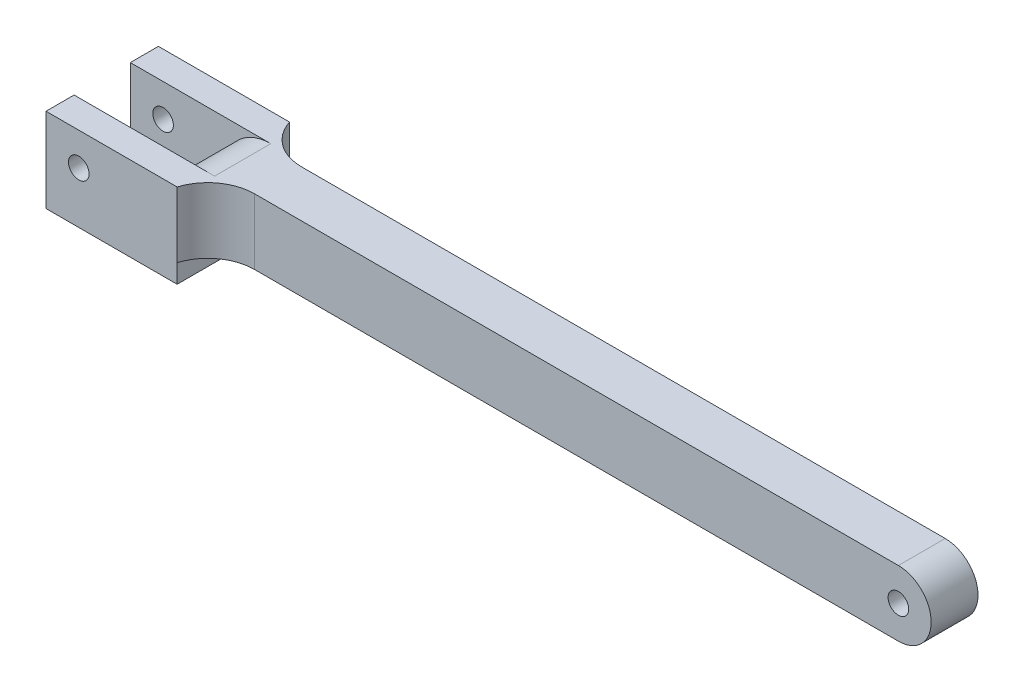
ISO-10303-21;
HEADER;
FILE_DESCRIPTION(('STEP AP214'),'2;1');
FILE_NAME('part.step','',(''),(''),'','','');
FILE_SCHEMA(('AUTOMOTIVE_DESIGN { 1 0 10303 214 1 1 1 1 }'));
ENDSEC;
DATA;
#1=APPLICATION_CONTEXT('core data for automotive mechanical design processes');
#2=APPLICATION_PROTOCOL_DEFINITION('international standard','automotive_design',2000,#1);
#3=PRODUCT_CONTEXT('',#1,'mechanical');
#4=PRODUCT('Part','Part','',(#3));
#5=PRODUCT_RELATED_PRODUCT_CATEGORY('part','',(#4));
#6=PRODUCT_DEFINITION_FORMATION('','',#4);
#7=PRODUCT_DEFINITION_CONTEXT('part definition',#1,'design');
#8=PRODUCT_DEFINITION('design','',#6,#7);
#9=PRODUCT_DEFINITION_SHAPE('','',#8);
#10=(LENGTH_UNIT() NAMED_UNIT(*) SI_UNIT(.MILLI.,.METRE.));
#11=(NAMED_UNIT(*) PLANE_ANGLE_UNIT() SI_UNIT($,.RADIAN.));
#12=(NAMED_UNIT(*) SI_UNIT($,.STERADIAN.) SOLID_ANGLE_UNIT());
#13=UNCERTAINTY_MEASURE_WITH_UNIT(LENGTH_MEASURE(1.E-05),#10,'distance_accuracy_value','');
#14=(GEOMETRIC_REPRESENTATION_CONTEXT(3) GLOBAL_UNCERTAINTY_ASSIGNED_CONTEXT((#13)) GLOBAL_UNIT_ASSIGNED_CONTEXT((#10,
#11,#12)) REPRESENTATION_CONTEXT('',''));
#15=CARTESIAN_POINT('',(0.,0.,0.));
#16=DIRECTION('',(0.,0.,1.));
#17=DIRECTION('',(1.,0.,0.));
#18=AXIS2_PLACEMENT_3D('',#15,#16,#17);
#19=CARTESIAN_POINT('',(-4.,-5.5,-3.5));
#20=DIRECTION('',(-1.,0.,0.));
#21=DIRECTION('',(0.,-1.,0.));
#22=AXIS2_PLACEMENT_3D('',#19,#20,#21);
#23=PLANE('',#22);
#24=DIRECTION('',(0.,-1.,0.));
#25=VECTOR('',#24,1.);
#26=CARTESIAN_POINT('',(-4.,3.5,5.5));
#27=LINE('',#26,#25);
#28=CARTESIAN_POINT('',(-4.,3.5,5.5));
#29=VERTEX_POINT('',#28);
#30=CARTESIAN_POINT('',(-4.,-5.5,5.5));
#31=VERTEX_POINT('',#30);
#32=EDGE_CURVE('E163',#29,#31,#27,.T.);
#33=ORIENTED_EDGE('',*,*,#32,.T.);
#34=DIRECTION('',(0.,0.,1.));
#35=VECTOR('',#34,1.);
#36=CARTESIAN_POINT('',(-4.,-5.5,-3.5));
#37=LINE('',#36,#35);
#38=CARTESIAN_POINT('',(-4.,-5.5,8.5));
#39=VERTEX_POINT('',#38);
#40=EDGE_CURVE('E169',#31,#39,#37,.T.);
#41=ORIENTED_EDGE('',*,*,#40,.T.);
#42=DIRECTION('',(0.,1.,0.));
#43=VECTOR('',#42,1.);
#44=CARTESIAN_POINT('',(-4.,-5.5,8.5));
#45=LINE('',#44,#43);
#46=CARTESIAN_POINT('',(-4.,3.5,8.5));
#47=VERTEX_POINT('',#46);
#48=EDGE_CURVE('E181',#39,#47,#45,.T.);
#49=ORIENTED_EDGE('',*,*,#48,.T.);
#50=DIRECTION('',(0.,0.,1.));
#51=VECTOR('',#50,1.);
#52=CARTESIAN_POINT('',(-4.,3.5,-3.5));
#53=LINE('',#52,#51);
#54=EDGE_CURVE('E159',#29,#47,#53,.T.);
#55=ORIENTED_EDGE('',*,*,#54,.F.);
#56=EDGE_LOOP('',(#33,#41,#49,#55));
#57=FACE_BOUND('',#56,.T.);
#58=ADVANCED_FACE('F33',(#57),#23,.T.);
#59=CARTESIAN_POINT('',(0.,-3.5,5.));
#60=DIRECTION('',(0.,1.,0.));
#61=DIRECTION('',(-1.,0.,0.));
#62=AXIS2_PLACEMENT_3D('',#59,#60,#61);
#63=PLANE('',#62);
#64=DIRECTION('',(1.,0.,0.));
#65=VECTOR('',#64,1.);
#66=CARTESIAN_POINT('',(0.,-3.5,5.));
#67=LINE('',#66,#65);
#68=CARTESIAN_POINT('',(14.7696960070847,-3.5,5.));
#69=VERTEX_POINT('',#68);
#70=CARTESIAN_POINT('',(83.5000000000008,-3.50000000000001,5.));
#71=VERTEX_POINT('',#70);
#72=EDGE_CURVE('E186',#69,#71,#67,.T.);
#73=ORIENTED_EDGE('',*,*,#72,.F.);
#74=CARTESIAN_POINT('',(14.7696960070847,-3.5,10.));
#75=DIRECTION('',(0.,1.,0.));
#76=DIRECTION('',(-1.,0.,0.));
#77=AXIS2_PLACEMENT_3D('',#74,#75,#76);
#78=CIRCLE('',#77,5.);
#79=CARTESIAN_POINT('',(10.,-3.5,8.5));
#80=VERTEX_POINT('',#79);
#81=EDGE_CURVE('E222',#69,#80,#78,.T.);
#82=ORIENTED_EDGE('',*,*,#81,.T.);
#83=DIRECTION('',(0.,0.,-1.));
#84=VECTOR('',#83,1.);
#85=CARTESIAN_POINT('',(10.,-3.5,5.));
#86=LINE('',#85,#84);
#87=CARTESIAN_POINT('',(10.,-3.5,-3.5));
#88=VERTEX_POINT('',#87);
#89=EDGE_CURVE('E172',#80,#88,#86,.T.);
#90=ORIENTED_EDGE('',*,*,#89,.T.);
#91=CARTESIAN_POINT('',(14.7696960070847,-3.5,-5.));
#92=DIRECTION('',(0.,1.,0.));
#93=DIRECTION('',(-1.,0.,0.));
#94=AXIS2_PLACEMENT_3D('',#91,#92,#93);
#95=CIRCLE('',#94,5.);
#96=CARTESIAN_POINT('',(14.7696960070847,-3.5,0.));
#97=VERTEX_POINT('',#96);
#98=EDGE_CURVE('E227',#88,#97,#95,.T.);
#99=ORIENTED_EDGE('',*,*,#98,.T.);
#100=DIRECTION('',(1.,0.,0.));
#101=VECTOR('',#100,1.);
#102=CARTESIAN_POINT('',(0.,-3.5,0.));
#103=LINE('',#102,#101);
#104=CARTESIAN_POINT('',(83.5000000000008,-3.50000000000001,0.));
#105=VERTEX_POINT('',#104);
#106=EDGE_CURVE('E185',#97,#105,#103,.T.);
#107=ORIENTED_EDGE('',*,*,#106,.T.);
#108=DIRECTION('',(0.,0.,-1.));
#109=VECTOR('',#108,1.);
#110=CARTESIAN_POINT('',(83.5000000000008,-3.50000000000001,5.));
#111=LINE('',#110,#109);
#112=EDGE_CURVE('E208',#71,#105,#111,.T.);
#113=ORIENTED_EDGE('',*,*,#112,.F.);
#114=EDGE_LOOP('',(#73,#82,#90,#99,#107,#113));
#115=FACE_BOUND('',#114,.T.);
#116=ADVANCED_FACE('F242',(#115),#63,.F.);
#117=CARTESIAN_POINT('',(83.5000000000008,0.,5.));
#118=DIRECTION('',(0.,0.,-1.));
#119=DIRECTION('',(-1.,0.,0.));
#120=AXIS2_PLACEMENT_3D('',#117,#118,#119);
#121=CYLINDRICAL_SURFACE('',#120,3.50000000000001);
#122=CARTESIAN_POINT('',(83.5000000000008,0.,0.));
#123=DIRECTION('',(0.,0.,1.));
#124=DIRECTION('',(1.,0.,0.));
#125=AXIS2_PLACEMENT_3D('',#122,#123,#124);
#126=CIRCLE('',#125,3.50000000000001);
#127=CARTESIAN_POINT('',(83.5000000000008,3.50000000000001,0.));
#128=VERTEX_POINT('',#127);
#129=EDGE_CURVE('E199',#105,#128,#126,.T.);
#130=ORIENTED_EDGE('',*,*,#129,.T.);
#131=DIRECTION('',(0.,0.,-1.));
#132=VECTOR('',#131,1.);
#133=CARTESIAN_POINT('',(83.5000000000008,3.50000000000001,5.));
#134=LINE('',#133,#132);
#135=CARTESIAN_POINT('',(83.5000000000008,3.50000000000001,5.));
#136=VERTEX_POINT('',#135);
#137=EDGE_CURVE('E197',#136,#128,#134,.T.);
#138=ORIENTED_EDGE('',*,*,#137,.F.);
#139=CARTESIAN_POINT('',(83.5000000000008,0.,5.));
#140=DIRECTION('',(0.,0.,1.));
#141=DIRECTION('',(1.,0.,0.));
#142=AXIS2_PLACEMENT_3D('',#139,#140,#141);
#143=CIRCLE('',#142,3.50000000000001);
#144=EDGE_CURVE('E188',#71,#136,#143,.T.);
#145=ORIENTED_EDGE('',*,*,#144,.F.);
#146=ORIENTED_EDGE('',*,*,#112,.T.);
#147=EDGE_LOOP('',(#130,#138,#145,#146));
#148=FACE_BOUND('',#147,.T.);
#149=ADVANCED_FACE('F248',(#148),#121,.T.);
#150=CARTESIAN_POINT('',(0.,3.5,5.));
#151=DIRECTION('',(0.,1.,0.));
#152=DIRECTION('',(-1.,0.,0.));
#153=AXIS2_PLACEMENT_3D('',#150,#151,#152);
#154=PLANE('',#153);
#155=DIRECTION('',(0.,0.,1.));
#156=VECTOR('',#155,1.);
#157=CARTESIAN_POINT('',(11.,3.5,5.5));
#158=LINE('',#157,#156);
#159=CARTESIAN_POINT('',(11.,3.5,-0.499999999999999));
#160=VERTEX_POINT('',#159);
#161=CARTESIAN_POINT('',(11.,3.5,5.5));
#162=VERTEX_POINT('',#161);
#163=EDGE_CURVE('E229',#160,#162,#158,.T.);
#164=ORIENTED_EDGE('',*,*,#163,.T.);
#165=DIRECTION('',(-1.,0.,0.));
#166=VECTOR('',#165,1.);
#167=CARTESIAN_POINT('',(-4.,3.5,5.5));
#168=LINE('',#167,#166);
#169=EDGE_CURVE('E142',#162,#29,#168,.T.);
#170=ORIENTED_EDGE('',*,*,#169,.T.);
#171=ORIENTED_EDGE('',*,*,#54,.T.);
#172=DIRECTION('',(1.,0.,0.));
#173=VECTOR('',#172,1.);
#174=CARTESIAN_POINT('',(-4.,3.5,8.5));
#175=LINE('',#174,#173);
#176=CARTESIAN_POINT('',(10.,3.5,8.5));
#177=VERTEX_POINT('',#176);
#178=EDGE_CURVE('E158',#47,#177,#175,.T.);
#179=ORIENTED_EDGE('',*,*,#178,.T.);
#180=CARTESIAN_POINT('',(14.7696960070847,3.5,10.));
#181=DIRECTION('',(0.,1.,0.));
#182=DIRECTION('',(-1.,0.,0.));
#183=AXIS2_PLACEMENT_3D('',#180,#181,#182);
#184=CIRCLE('',#183,5.);
#185=CARTESIAN_POINT('',(14.7696960070847,3.5,5.));
#186=VERTEX_POINT('',#185);
#187=EDGE_CURVE('E220',#177,#186,#184,.F.);
#188=ORIENTED_EDGE('',*,*,#187,.T.);
#189=DIRECTION('',(1.,0.,0.));
#190=VECTOR('',#189,1.);
#191=CARTESIAN_POINT('',(0.,3.5,5.));
#192=LINE('',#191,#190);
#193=EDGE_CURVE('E192',#186,#136,#192,.T.);
#194=ORIENTED_EDGE('',*,*,#193,.T.);
#195=ORIENTED_EDGE('',*,*,#137,.T.);
#196=DIRECTION('',(1.,0.,0.));
#197=VECTOR('',#196,1.);
#198=CARTESIAN_POINT('',(0.,3.5,0.));
#199=LINE('',#198,#197);
#200=CARTESIAN_POINT('',(14.7696960070847,3.5,0.));
#201=VERTEX_POINT('',#200);
#202=EDGE_CURVE('E202',#201,#128,#199,.T.);
#203=ORIENTED_EDGE('',*,*,#202,.F.);
#204=CARTESIAN_POINT('',(14.7696960070847,3.5,-5.));
#205=DIRECTION('',(0.,1.,0.));
#206=DIRECTION('',(-1.,0.,0.));
#207=AXIS2_PLACEMENT_3D('',#204,#205,#206);
#208=CIRCLE('',#207,5.);
#209=CARTESIAN_POINT('',(10.,3.5,-3.5));
#210=VERTEX_POINT('',#209);
#211=EDGE_CURVE('E225',#201,#210,#208,.F.);
#212=ORIENTED_EDGE('',*,*,#211,.T.);
#213=DIRECTION('',(-1.,0.,0.));
#214=VECTOR('',#213,1.);
#215=CARTESIAN_POINT('',(-4.,3.5,-3.5));
#216=LINE('',#215,#214);
#217=CARTESIAN_POINT('',(-4.,3.5,-3.5));
#218=VERTEX_POINT('',#217);
#219=EDGE_CURVE('E157',#210,#218,#216,.T.);
#220=ORIENTED_EDGE('',*,*,#219,.T.);
#221=CARTESIAN_POINT('',(-4.,3.5,-0.499999999999999));
#222=VERTEX_POINT('',#221);
#223=EDGE_CURVE('E149',#218,#222,#53,.T.);
#224=ORIENTED_EDGE('',*,*,#223,.T.);
#225=DIRECTION('',(1.,0.,0.));
#226=VECTOR('',#225,1.);
#227=CARTESIAN_POINT('',(-4.,3.5,-0.499999999999999));
#228=LINE('',#227,#226);
#229=EDGE_CURVE('E131',#222,#160,#228,.T.);
#230=ORIENTED_EDGE('',*,*,#229,.T.);
#231=EDGE_LOOP('',(#164,#170,#171,#179,#188,#194,#195,#203,#212,#220,#224,#230));
#232=FACE_BOUND('',#231,.T.);
#233=ADVANCED_FACE('F155',(#232),#154,.T.);
#234=CARTESIAN_POINT('',(83.5000000000008,0.,5.));
#235=DIRECTION('',(0.,0.,-1.));
#236=DIRECTION('',(-1.,0.,0.));
#237=AXIS2_PLACEMENT_3D('',#234,#235,#236);
#238=CYLINDRICAL_SURFACE('',#237,1.10000000000001);
#239=CARTESIAN_POINT('',(83.5000000000008,0.,5.));
#240=DIRECTION('',(0.,0.,1.));
#241=DIRECTION('',(1.,0.,0.));
#242=AXIS2_PLACEMENT_3D('',#239,#240,#241);
#243=CIRCLE('',#242,1.10000000000001);
#244=CARTESIAN_POINT('',(84.6000000000008,0.,5.));
#245=VERTEX_POINT('',#244);
#246=EDGE_CURVE('E194',#245,#245,#243,.T.);
#247=ORIENTED_EDGE('',*,*,#246,.T.);
#248=EDGE_LOOP('',(#247));
#249=FACE_BOUND('',#248,.T.);
#250=CARTESIAN_POINT('',(83.5000000000008,0.,0.));
#251=DIRECTION('',(0.,0.,1.));
#252=DIRECTION('',(1.,0.,0.));
#253=AXIS2_PLACEMENT_3D('',#250,#251,#252);
#254=CIRCLE('',#253,1.10000000000001);
#255=CARTESIAN_POINT('',(84.6000000000008,0.,0.));
#256=VERTEX_POINT('',#255);
#257=EDGE_CURVE('E189',#256,#256,#254,.T.);
#258=ORIENTED_EDGE('',*,*,#257,.F.);
#259=EDGE_LOOP('',(#258));
#260=FACE_BOUND('',#259,.T.);
#261=ADVANCED_FACE('F270',(#249,#260),#238,.F.);
#262=CARTESIAN_POINT('',(0.,0.,5.));
#263=DIRECTION('',(0.,0.,1.));
#264=DIRECTION('',(1.,0.,0.));
#265=AXIS2_PLACEMENT_3D('',#262,#263,#264);
#266=PLANE('',#265);
#267=ORIENTED_EDGE('',*,*,#193,.F.);
#268=DIRECTION('',(0.,1.,0.));
#269=VECTOR('',#268,1.);
#270=CARTESIAN_POINT('',(14.7696960070847,-3.5,5.));
#271=LINE('',#270,#269);
#272=EDGE_CURVE('E211',#186,#69,#271,.F.);
#273=ORIENTED_EDGE('',*,*,#272,.T.);
#274=ORIENTED_EDGE('',*,*,#72,.T.);
#275=ORIENTED_EDGE('',*,*,#144,.T.);
#276=EDGE_LOOP('',(#267,#273,#274,#275));
#277=FACE_BOUND('',#276,.T.);
#278=ORIENTED_EDGE('',*,*,#246,.F.);
#279=EDGE_LOOP('',(#278));
#280=FACE_BOUND('',#279,.T.);
#281=ADVANCED_FACE('F264',(#277,#280),#266,.T.);
#282=CARTESIAN_POINT('',(0.,0.,0.));
#283=DIRECTION('',(0.,0.,1.));
#284=DIRECTION('',(1.,0.,0.));
#285=AXIS2_PLACEMENT_3D('',#282,#283,#284);
#286=PLANE('',#285);
#287=ORIENTED_EDGE('',*,*,#106,.F.);
#288=DIRECTION('',(0.,1.,0.));
#289=VECTOR('',#288,1.);
#290=CARTESIAN_POINT('',(14.7696960070847,0.,0.));
#291=LINE('',#290,#289);
#292=EDGE_CURVE('E217',#97,#201,#291,.T.);
#293=ORIENTED_EDGE('',*,*,#292,.T.);
#294=ORIENTED_EDGE('',*,*,#202,.T.);
#295=ORIENTED_EDGE('',*,*,#129,.F.);
#296=EDGE_LOOP('',(#287,#293,#294,#295));
#297=FACE_BOUND('',#296,.T.);
#298=ORIENTED_EDGE('',*,*,#257,.T.);
#299=EDGE_LOOP('',(#298));
#300=FACE_BOUND('',#299,.T.);
#301=ADVANCED_FACE('F256',(#297,#300),#286,.F.);
#302=DIRECTION('',(0.,-1.,0.));
#303=VECTOR('',#302,1.);
#304=CARTESIAN_POINT('',(-4.,3.5,-0.499999999999999));
#305=LINE('',#304,#303);
#306=CARTESIAN_POINT('',(-4.,-5.5,-0.499999999999999));
#307=VERTEX_POINT('',#306);
#308=EDGE_CURVE('E135',#222,#307,#305,.T.);
#309=ORIENTED_EDGE('',*,*,#308,.F.);
#310=ORIENTED_EDGE('',*,*,#223,.F.);
#311=DIRECTION('',(0.,1.,0.));
#312=VECTOR('',#311,1.);
#313=CARTESIAN_POINT('',(-4.,-5.5,-3.5));
#314=LINE('',#313,#312);
#315=CARTESIAN_POINT('',(-4.,-5.5,-3.5));
#316=VERTEX_POINT('',#315);
#317=EDGE_CURVE('E170',#316,#218,#314,.T.);
#318=ORIENTED_EDGE('',*,*,#317,.F.);
#319=EDGE_CURVE('E152',#316,#307,#37,.T.);
#320=ORIENTED_EDGE('',*,*,#319,.T.);
#321=EDGE_LOOP('',(#309,#310,#318,#320));
#322=FACE_BOUND('',#321,.T.);
#323=ADVANCED_FACE('F148',(#322),#23,.T.);
#324=CARTESIAN_POINT('',(-4.,-5.5,-3.5));
#325=DIRECTION('',(0.,0.,-1.));
#326=DIRECTION('',(-1.,0.,0.));
#327=AXIS2_PLACEMENT_3D('',#324,#325,#326);
#328=PLANE('',#327);
#329=CARTESIAN_POINT('',(-0.5,0.,-3.5));
#330=DIRECTION('',(0.,0.,-1.));
#331=DIRECTION('',(-1.,0.,0.));
#332=AXIS2_PLACEMENT_3D('',#329,#330,#331);
#333=CIRCLE('',#332,1.1);
#334=CARTESIAN_POINT('',(-1.6,0.,-3.5));
#335=VERTEX_POINT('',#334);
#336=EDGE_CURVE('E328',#335,#335,#333,.T.);
#337=ORIENTED_EDGE('',*,*,#336,.F.);
#338=EDGE_LOOP('',(#337));
#339=FACE_BOUND('',#338,.T.);
#340=ORIENTED_EDGE('',*,*,#219,.F.);
#341=DIRECTION('',(0.,1.,0.));
#342=VECTOR('',#341,1.);
#343=CARTESIAN_POINT('',(10.,-5.5,-3.5));
#344=LINE('',#343,#342);
#345=EDGE_CURVE('E176',#88,#210,#344,.T.);
#346=ORIENTED_EDGE('',*,*,#345,.F.);
#347=CARTESIAN_POINT('',(10.,-5.5,-3.5));
#348=VERTEX_POINT('',#347);
#349=EDGE_CURVE('E173',#348,#88,#344,.T.);
#350=ORIENTED_EDGE('',*,*,#349,.F.);
#351=DIRECTION('',(-1.,0.,0.));
#352=VECTOR('',#351,1.);
#353=CARTESIAN_POINT('',(-4.,-5.5,-3.5));
#354=LINE('',#353,#352);
#355=EDGE_CURVE('E165',#348,#316,#354,.T.);
#356=ORIENTED_EDGE('',*,*,#355,.T.);
#357=ORIENTED_EDGE('',*,*,#317,.T.);
#358=EDGE_LOOP('',(#340,#346,#350,#356,#357));
#359=FACE_BOUND('',#358,.T.);
#360=ADVANCED_FACE('F255',(#339,#359),#328,.T.);
#361=CARTESIAN_POINT('',(10.,-5.5,-3.5));
#362=DIRECTION('',(1.,0.,0.));
#363=DIRECTION('',(0.,0.,-1.));
#364=AXIS2_PLACEMENT_3D('',#361,#362,#363);
#365=PLANE('',#364);
#366=ORIENTED_EDGE('',*,*,#89,.F.);
#367=DIRECTION('',(0.,1.,0.));
#368=VECTOR('',#367,1.);
#369=CARTESIAN_POINT('',(10.,-5.5,8.5));
#370=LINE('',#369,#368);
#371=CARTESIAN_POINT('',(10.,-5.5,8.5));
#372=VERTEX_POINT('',#371);
#373=EDGE_CURVE('E177',#372,#80,#370,.T.);
#374=ORIENTED_EDGE('',*,*,#373,.F.);
#375=DIRECTION('',(0.,0.,-1.));
#376=VECTOR('',#375,1.);
#377=CARTESIAN_POINT('',(10.,-5.5,-3.5));
#378=LINE('',#377,#376);
#379=EDGE_CURVE('E309',#372,#348,#378,.T.);
#380=ORIENTED_EDGE('',*,*,#379,.T.);
#381=ORIENTED_EDGE('',*,*,#349,.T.);
#382=EDGE_LOOP('',(#366,#374,#380,#381));
#383=FACE_BOUND('',#382,.T.);
#384=ADVANCED_FACE('F261',(#383),#365,.T.);
#385=CARTESIAN_POINT('',(-4.,-5.5,8.5));
#386=DIRECTION('',(0.,0.,1.));
#387=DIRECTION('',(1.,0.,0.));
#388=AXIS2_PLACEMENT_3D('',#385,#386,#387);
#389=PLANE('',#388);
#390=CARTESIAN_POINT('',(-0.5,0.,8.5));
#391=DIRECTION('',(0.,0.,1.));
#392=DIRECTION('',(1.,0.,0.));
#393=AXIS2_PLACEMENT_3D('',#390,#391,#392);
#394=CIRCLE('',#393,1.1);
#395=CARTESIAN_POINT('',(0.6,0.,8.5));
#396=VERTEX_POINT('',#395);
#397=EDGE_CURVE('E332',#396,#396,#394,.T.);
#398=ORIENTED_EDGE('',*,*,#397,.F.);
#399=EDGE_LOOP('',(#398));
#400=FACE_BOUND('',#399,.T.);
#401=ORIENTED_EDGE('',*,*,#178,.F.);
#402=ORIENTED_EDGE('',*,*,#48,.F.);
#403=DIRECTION('',(1.,0.,0.));
#404=VECTOR('',#403,1.);
#405=CARTESIAN_POINT('',(-4.,-5.5,8.5));
#406=LINE('',#405,#404);
#407=EDGE_CURVE('E305',#39,#372,#406,.T.);
#408=ORIENTED_EDGE('',*,*,#407,.T.);
#409=ORIENTED_EDGE('',*,*,#373,.T.);
#410=EDGE_CURVE('E180',#80,#177,#370,.T.);
#411=ORIENTED_EDGE('',*,*,#410,.T.);
#412=EDGE_LOOP('',(#401,#402,#408,#409,#411));
#413=FACE_BOUND('',#412,.T.);
#414=ADVANCED_FACE('F302',(#400,#413),#389,.T.);
#415=CARTESIAN_POINT('',(0.,-5.5,0.));
#416=DIRECTION('',(0.,1.,0.));
#417=DIRECTION('',(-1.,0.,0.));
#418=AXIS2_PLACEMENT_3D('',#415,#416,#417);
#419=PLANE('',#418);
#420=ORIENTED_EDGE('',*,*,#40,.F.);
#421=DIRECTION('',(-1.,0.,0.));
#422=VECTOR('',#421,1.);
#423=CARTESIAN_POINT('',(-4.,-5.5,5.5));
#424=LINE('',#423,#422);
#425=CARTESIAN_POINT('',(6.,-5.5,5.5));
#426=VERTEX_POINT('',#425);
#427=EDGE_CURVE('E143',#426,#31,#424,.T.);
#428=ORIENTED_EDGE('',*,*,#427,.F.);
#429=DIRECTION('',(0.,0.,1.));
#430=VECTOR('',#429,1.);
#431=CARTESIAN_POINT('',(6.,-5.5,5.5));
#432=LINE('',#431,#430);
#433=CARTESIAN_POINT('',(6.,-5.5,-0.499999999999999));
#434=VERTEX_POINT('',#433);
#435=EDGE_CURVE('E323',#434,#426,#432,.T.);
#436=ORIENTED_EDGE('',*,*,#435,.F.);
#437=DIRECTION('',(1.,0.,0.));
#438=VECTOR('',#437,1.);
#439=CARTESIAN_POINT('',(-4.,-5.5,-0.499999999999999));
#440=LINE('',#439,#438);
#441=EDGE_CURVE('E326',#307,#434,#440,.T.);
#442=ORIENTED_EDGE('',*,*,#441,.F.);
#443=ORIENTED_EDGE('',*,*,#319,.F.);
#444=ORIENTED_EDGE('',*,*,#355,.F.);
#445=ORIENTED_EDGE('',*,*,#379,.F.);
#446=ORIENTED_EDGE('',*,*,#407,.F.);
#447=EDGE_LOOP('',(#420,#428,#436,#442,#443,#444,#445,#446));
#448=FACE_BOUND('',#447,.T.);
#449=ADVANCED_FACE('F313',(#448),#419,.F.);
#450=CARTESIAN_POINT('',(-4.,3.5,5.5));
#451=DIRECTION('',(0.,0.,1.));
#452=DIRECTION('',(0.,-1.,0.));
#453=AXIS2_PLACEMENT_3D('',#450,#451,#452);
#454=PLANE('',#453);
#455=CARTESIAN_POINT('',(-0.5,0.,5.5));
#456=DIRECTION('',(0.,0.,1.));
#457=DIRECTION('',(0.,-1.,0.));
#458=AXIS2_PLACEMENT_3D('',#455,#456,#457);
#459=CIRCLE('',#458,1.1);
#460=CARTESIAN_POINT('',(-0.5,-1.1,5.5));
#461=VERTEX_POINT('',#460);
#462=EDGE_CURVE('E215',#461,#461,#459,.T.);
#463=ORIENTED_EDGE('',*,*,#462,.T.);
#464=EDGE_LOOP('',(#463));
#465=FACE_BOUND('',#464,.T.);
#466=ORIENTED_EDGE('',*,*,#427,.T.);
#467=ORIENTED_EDGE('',*,*,#32,.F.);
#468=ORIENTED_EDGE('',*,*,#169,.F.);
#469=CARTESIAN_POINT('',(11.,-1.5,5.5));
#470=DIRECTION('',(0.,0.,1.));
#471=DIRECTION('',(0.,-1.,0.));
#472=AXIS2_PLACEMENT_3D('',#469,#470,#471);
#473=CIRCLE('',#472,5.);
#474=CARTESIAN_POINT('',(6.,-1.5,5.5));
#475=VERTEX_POINT('',#474);
#476=EDGE_CURVE('E41',#162,#475,#473,.T.);
#477=ORIENTED_EDGE('',*,*,#476,.T.);
#478=DIRECTION('',(0.,-1.,0.));
#479=VECTOR('',#478,1.);
#480=CARTESIAN_POINT('',(6.,3.5,5.5));
#481=LINE('',#480,#479);
#482=EDGE_CURVE('E319',#475,#426,#481,.T.);
#483=ORIENTED_EDGE('',*,*,#482,.T.);
#484=EDGE_LOOP('',(#466,#467,#468,#477,#483));
#485=FACE_BOUND('',#484,.T.);
#486=ADVANCED_FACE('F338',(#465,#485),#454,.F.);
#487=CARTESIAN_POINT('',(6.,3.5,5.5));
#488=DIRECTION('',(1.,0.,0.));
#489=DIRECTION('',(0.,0.,-1.));
#490=AXIS2_PLACEMENT_3D('',#487,#488,#489);
#491=PLANE('',#490);
#492=ORIENTED_EDGE('',*,*,#482,.F.);
#493=DIRECTION('',(0.,0.,1.));
#494=VECTOR('',#493,1.);
#495=CARTESIAN_POINT('',(6.,-1.5,-0.499999999999999));
#496=LINE('',#495,#494);
#497=CARTESIAN_POINT('',(6.,-1.5,-0.499999999999999));
#498=VERTEX_POINT('',#497);
#499=EDGE_CURVE('E48',#475,#498,#496,.F.);
#500=ORIENTED_EDGE('',*,*,#499,.T.);
#501=DIRECTION('',(0.,-1.,0.));
#502=VECTOR('',#501,1.);
#503=CARTESIAN_POINT('',(6.,3.5,-0.499999999999999));
#504=LINE('',#503,#502);
#505=EDGE_CURVE('E153',#498,#434,#504,.T.);
#506=ORIENTED_EDGE('',*,*,#505,.T.);
#507=ORIENTED_EDGE('',*,*,#435,.T.);
#508=EDGE_LOOP('',(#492,#500,#506,#507));
#509=FACE_BOUND('',#508,.T.);
#510=ADVANCED_FACE('F341',(#509),#491,.F.);
#511=CARTESIAN_POINT('',(-4.,3.5,-0.499999999999999));
#512=DIRECTION('',(0.,0.,-1.));
#513=DIRECTION('',(0.,1.,0.));
#514=AXIS2_PLACEMENT_3D('',#511,#512,#513);
#515=PLANE('',#514);
#516=CARTESIAN_POINT('',(-0.5,0.,-0.499999999999999));
#517=DIRECTION('',(0.,0.,-1.));
#518=DIRECTION('',(0.,1.,0.));
#519=AXIS2_PLACEMENT_3D('',#516,#517,#518);
#520=CIRCLE('',#519,1.1);
#521=CARTESIAN_POINT('',(-0.5,1.1,-0.499999999999999));
#522=VERTEX_POINT('',#521);
#523=EDGE_CURVE('E212',#522,#522,#520,.T.);
#524=ORIENTED_EDGE('',*,*,#523,.T.);
#525=EDGE_LOOP('',(#524));
#526=FACE_BOUND('',#525,.T.);
#527=ORIENTED_EDGE('',*,*,#441,.T.);
#528=ORIENTED_EDGE('',*,*,#505,.F.);
#529=CARTESIAN_POINT('',(11.,-1.5,-0.499999999999999));
#530=DIRECTION('',(0.,0.,-1.));
#531=DIRECTION('',(0.,1.,0.));
#532=AXIS2_PLACEMENT_3D('',#529,#530,#531);
#533=CIRCLE('',#532,5.);
#534=EDGE_CURVE('E11',#498,#160,#533,.T.);
#535=ORIENTED_EDGE('',*,*,#534,.T.);
#536=ORIENTED_EDGE('',*,*,#229,.F.);
#537=ORIENTED_EDGE('',*,*,#308,.T.);
#538=EDGE_LOOP('',(#527,#528,#535,#536,#537));
#539=FACE_BOUND('',#538,.T.);
#540=ADVANCED_FACE('F134',(#526,#539),#515,.F.);
#541=CARTESIAN_POINT('',(-0.5,0.,10.));
#542=DIRECTION('',(0.,0.,-1.));
#543=DIRECTION('',(-1.,0.,0.));
#544=AXIS2_PLACEMENT_3D('',#541,#542,#543);
#545=CYLINDRICAL_SURFACE('',#544,1.1);
#546=ORIENTED_EDGE('',*,*,#336,.T.);
#547=EDGE_LOOP('',(#546));
#548=FACE_BOUND('',#547,.T.);
#549=ORIENTED_EDGE('',*,*,#523,.F.);
#550=EDGE_LOOP('',(#549));
#551=FACE_BOUND('',#550,.T.);
#552=ADVANCED_FACE('F289',(#548,#551),#545,.F.);
#553=ORIENTED_EDGE('',*,*,#397,.T.);
#554=EDGE_LOOP('',(#553));
#555=FACE_BOUND('',#554,.T.);
#556=ORIENTED_EDGE('',*,*,#462,.F.);
#557=EDGE_LOOP('',(#556));
#558=FACE_BOUND('',#557,.T.);
#559=ADVANCED_FACE('F284',(#555,#558),#545,.F.);
#560=CARTESIAN_POINT('',(14.7696960070847,-5.5,10.));
#561=DIRECTION('',(0.,-1.,0.));
#562=DIRECTION('',(1.,0.,0.));
#563=AXIS2_PLACEMENT_3D('',#560,#561,#562);
#564=CYLINDRICAL_SURFACE('',#563,5.);
#565=ORIENTED_EDGE('',*,*,#81,.F.);
#566=ORIENTED_EDGE('',*,*,#272,.F.);
#567=ORIENTED_EDGE('',*,*,#187,.F.);
#568=ORIENTED_EDGE('',*,*,#410,.F.);
#569=EDGE_LOOP('',(#565,#566,#567,#568));
#570=FACE_BOUND('',#569,.T.);
#571=ADVANCED_FACE('F239',(#570),#564,.F.);
#572=CARTESIAN_POINT('',(14.7696960070847,-5.5,-5.));
#573=DIRECTION('',(0.,1.,0.));
#574=DIRECTION('',(-1.,0.,0.));
#575=AXIS2_PLACEMENT_3D('',#572,#573,#574);
#576=CYLINDRICAL_SURFACE('',#575,5.);
#577=ORIENTED_EDGE('',*,*,#98,.F.);
#578=ORIENTED_EDGE('',*,*,#345,.T.);
#579=ORIENTED_EDGE('',*,*,#211,.F.);
#580=ORIENTED_EDGE('',*,*,#292,.F.);
#581=EDGE_LOOP('',(#577,#578,#579,#580));
#582=FACE_BOUND('',#581,.T.);
#583=ADVANCED_FACE('F235',(#582),#576,.F.);
#584=CARTESIAN_POINT('',(11.,-1.5,5.));
#585=DIRECTION('',(0.,0.,-1.));
#586=DIRECTION('',(-1.,0.,0.));
#587=AXIS2_PLACEMENT_3D('',#584,#585,#586);
#588=CYLINDRICAL_SURFACE('',#587,5.);
#589=ORIENTED_EDGE('',*,*,#534,.F.);
#590=ORIENTED_EDGE('',*,*,#499,.F.);
#591=ORIENTED_EDGE('',*,*,#476,.F.);
#592=ORIENTED_EDGE('',*,*,#163,.F.);
#593=EDGE_LOOP('',(#589,#590,#591,#592));
#594=FACE_BOUND('',#593,.T.);
#595=ADVANCED_FACE('F35',(#594),#588,.T.);
#596=CLOSED_SHELL('',(#58,#116,#149,#233,#261,#281,#301,#323,#360,#384,#414,#449,#486,#510,#540,
#552,#559,#571,#583,#595));
#597=MANIFOLD_SOLID_BREP('B2',#596);
#598=ADVANCED_BREP_SHAPE_REPRESENTATION('',(#18,#597),#14);
#599=SHAPE_DEFINITION_REPRESENTATION(#9,#598);
ENDSEC;
END-ISO-10303-21;
